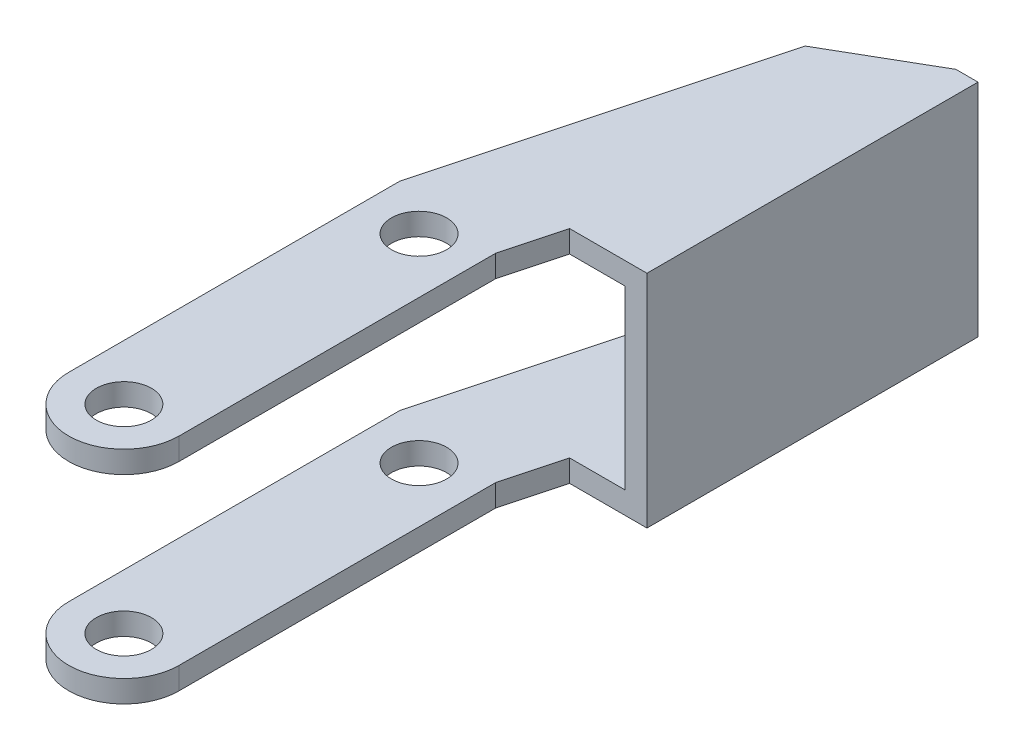
ISO-10303-21;
HEADER;
FILE_DESCRIPTION(('STEP AP214'),'2;1');
FILE_NAME('part.step','',(''),(''),'','','');
FILE_SCHEMA(('AUTOMOTIVE_DESIGN { 1 0 10303 214 1 1 1 1 }'));
ENDSEC;
DATA;
#1=APPLICATION_CONTEXT('core data for automotive mechanical design processes');
#2=APPLICATION_PROTOCOL_DEFINITION('international standard','automotive_design',2000,#1);
#3=PRODUCT_CONTEXT('',#1,'mechanical');
#4=PRODUCT('Part','Part','',(#3));
#5=PRODUCT_RELATED_PRODUCT_CATEGORY('part','',(#4));
#6=PRODUCT_DEFINITION_FORMATION('','',#4);
#7=PRODUCT_DEFINITION_CONTEXT('part definition',#1,'design');
#8=PRODUCT_DEFINITION('design','',#6,#7);
#9=PRODUCT_DEFINITION_SHAPE('','',#8);
#10=(LENGTH_UNIT() NAMED_UNIT(*) SI_UNIT(.MILLI.,.METRE.));
#11=(NAMED_UNIT(*) PLANE_ANGLE_UNIT() SI_UNIT($,.RADIAN.));
#12=(NAMED_UNIT(*) SI_UNIT($,.STERADIAN.) SOLID_ANGLE_UNIT());
#13=UNCERTAINTY_MEASURE_WITH_UNIT(LENGTH_MEASURE(1.E-05),#10,'distance_accuracy_value','');
#14=(GEOMETRIC_REPRESENTATION_CONTEXT(3) GLOBAL_UNCERTAINTY_ASSIGNED_CONTEXT((#13)) GLOBAL_UNIT_ASSIGNED_CONTEXT((#10,
#11,#12)) REPRESENTATION_CONTEXT('',''));
#15=CARTESIAN_POINT('',(0.,0.,0.));
#16=DIRECTION('',(0.,0.,1.));
#17=DIRECTION('',(1.,0.,0.));
#18=AXIS2_PLACEMENT_3D('',#15,#16,#17);
#19=CARTESIAN_POINT('',(-22.,0.,-1.52743803433517E-13));
#20=DIRECTION('',(-1.,0.,0.));
#21=DIRECTION('',(0.,0.,1.));
#22=AXIS2_PLACEMENT_3D('',#19,#20,#21);
#23=PLANE('',#22);
#24=DIRECTION('',(0.,-1.,0.));
#25=VECTOR('',#24,1.);
#26=CARTESIAN_POINT('',(-21.9999999999999,10.,-15.0000000000001));
#27=LINE('',#26,#25);
#28=CARTESIAN_POINT('',(-21.9999999999999,8.,-15.0000000000001));
#29=VERTEX_POINT('',#28);
#30=CARTESIAN_POINT('',(-21.9999999999999,-8.,-15.0000000000001));
#31=VERTEX_POINT('',#30);
#32=EDGE_CURVE('E299',#29,#31,#27,.T.);
#33=ORIENTED_EDGE('',*,*,#32,.T.);
#34=DIRECTION('',(0.,0.,1.));
#35=VECTOR('',#34,1.);
#36=CARTESIAN_POINT('',(-22.,-8.,-1.52655665885959E-13));
#37=LINE('',#36,#35);
#38=CARTESIAN_POINT('',(-22.0000000000001,-8.,14.9999999999999));
#39=VERTEX_POINT('',#38);
#40=EDGE_CURVE('E51',#31,#39,#37,.T.);
#41=ORIENTED_EDGE('',*,*,#40,.T.);
#42=DIRECTION('',(0.,1.,0.));
#43=VECTOR('',#42,1.);
#44=CARTESIAN_POINT('',(-22.0000000000001,10.,14.9999999999999));
#45=LINE('',#44,#43);
#46=CARTESIAN_POINT('',(-22.0000000000001,8.,14.9999999999999));
#47=VERTEX_POINT('',#46);
#48=EDGE_CURVE('E297',#39,#47,#45,.T.);
#49=ORIENTED_EDGE('',*,*,#48,.T.);
#50=DIRECTION('',(0.,0.,1.));
#51=VECTOR('',#50,1.);
#52=CARTESIAN_POINT('',(-22.,8.,-1.52655665885959E-13));
#53=LINE('',#52,#51);
#54=EDGE_CURVE('E252',#29,#47,#53,.T.);
#55=ORIENTED_EDGE('',*,*,#54,.F.);
#56=EDGE_LOOP('',(#33,#41,#49,#55));
#57=FACE_BOUND('',#56,.T.);
#58=ADVANCED_FACE('F36',(#57),#23,.T.);
#59=CARTESIAN_POINT('',(-22.0000000000001,10.,14.9999999999999));
#60=DIRECTION('',(0.,0.,-1.));
#61=DIRECTION('',(-1.,0.,0.));
#62=AXIS2_PLACEMENT_3D('',#59,#60,#61);
#63=PLANE('',#62);
#64=DIRECTION('',(0.,1.,0.));
#65=VECTOR('',#64,1.);
#66=CARTESIAN_POINT('',(-20.0000000000001,10.,14.9999999999999));
#67=LINE('',#66,#65);
#68=CARTESIAN_POINT('',(-20.0000000000001,-10.,14.9999999999999));
#69=VERTEX_POINT('',#68);
#70=CARTESIAN_POINT('',(-20.0000000000001,10.,14.9999999999999));
#71=VERTEX_POINT('',#70);
#72=EDGE_CURVE('E286',#69,#71,#67,.T.);
#73=ORIENTED_EDGE('',*,*,#72,.T.);
#74=DIRECTION('',(1.,0.,0.));
#75=VECTOR('',#74,1.);
#76=CARTESIAN_POINT('',(-22.0000000000001,10.,14.9999999999999));
#77=LINE('',#76,#75);
#78=CARTESIAN_POINT('',(-27.0062220445211,10.,14.9999999999999));
#79=VERTEX_POINT('',#78);
#80=EDGE_CURVE('E11',#79,#71,#77,.T.);
#81=ORIENTED_EDGE('',*,*,#80,.F.);
#82=DIRECTION('',(0.,1.,0.));
#83=VECTOR('',#82,1.);
#84=CARTESIAN_POINT('',(-27.0062220445211,8.,14.9999999999999));
#85=LINE('',#84,#83);
#86=CARTESIAN_POINT('',(-27.0062220445211,8.,14.9999999999999));
#87=VERTEX_POINT('',#86);
#88=EDGE_CURVE('E289',#87,#79,#85,.T.);
#89=ORIENTED_EDGE('',*,*,#88,.F.);
#90=DIRECTION('',(1.,0.,0.));
#91=VECTOR('',#90,1.);
#92=CARTESIAN_POINT('',(0.,8.,15.));
#93=LINE('',#92,#91);
#94=EDGE_CURVE('E249',#87,#47,#93,.T.);
#95=ORIENTED_EDGE('',*,*,#94,.T.);
#96=ORIENTED_EDGE('',*,*,#48,.F.);
#97=DIRECTION('',(1.,0.,0.));
#98=VECTOR('',#97,1.);
#99=CARTESIAN_POINT('',(0.,-8.,15.));
#100=LINE('',#99,#98);
#101=CARTESIAN_POINT('',(-27.0062220445211,-8.,14.9999999999999));
#102=VERTEX_POINT('',#101);
#103=EDGE_CURVE('E191',#102,#39,#100,.T.);
#104=ORIENTED_EDGE('',*,*,#103,.F.);
#105=DIRECTION('',(0.,-1.,0.));
#106=VECTOR('',#105,1.);
#107=CARTESIAN_POINT('',(-27.0062220445211,-8.,14.9999999999999));
#108=LINE('',#107,#106);
#109=CARTESIAN_POINT('',(-27.0062220445211,-10.,14.9999999999999));
#110=VERTEX_POINT('',#109);
#111=EDGE_CURVE('E226',#102,#110,#108,.T.);
#112=ORIENTED_EDGE('',*,*,#111,.T.);
#113=DIRECTION('',(1.,0.,0.));
#114=VECTOR('',#113,1.);
#115=CARTESIAN_POINT('',(-22.0000000000001,-10.,14.9999999999999));
#116=LINE('',#115,#114);
#117=EDGE_CURVE('E304',#110,#69,#116,.T.);
#118=ORIENTED_EDGE('',*,*,#117,.T.);
#119=EDGE_LOOP('',(#73,#81,#89,#95,#96,#104,#112,#118));
#120=FACE_BOUND('',#119,.T.);
#121=ADVANCED_FACE('F38',(#120),#63,.F.);
#122=CARTESIAN_POINT('',(-21.9999999999999,10.,-15.0000000000001));
#123=DIRECTION('',(0.,-1.,0.));
#124=DIRECTION('',(0.,0.,-1.));
#125=AXIS2_PLACEMENT_3D('',#122,#123,#124);
#126=PLANE('',#125);
#127=DIRECTION('',(0.,0.,-1.));
#128=VECTOR('',#127,1.);
#129=CARTESIAN_POINT('',(-19.9999999999999,10.,-15.0000000000001));
#130=LINE('',#129,#128);
#131=CARTESIAN_POINT('',(-19.9999999999999,10.,-15.0000000000001));
#132=VERTEX_POINT('',#131);
#133=EDGE_CURVE('E307',#71,#132,#130,.T.);
#134=ORIENTED_EDGE('',*,*,#133,.T.);
#135=DIRECTION('',(1.,0.,0.));
#136=VECTOR('',#135,1.);
#137=CARTESIAN_POINT('',(-21.9999999999999,10.,-15.0000000000001));
#138=LINE('',#137,#136);
#139=CARTESIAN_POINT('',(-21.9999999999999,10.,-15.0000000000001));
#140=VERTEX_POINT('',#139);
#141=EDGE_CURVE('E44',#140,#132,#138,.T.);
#142=ORIENTED_EDGE('',*,*,#141,.F.);
#143=DIRECTION('',(-0.866025403784429,0.,0.500000000000017));
#144=VECTOR('',#143,1.);
#145=CARTESIAN_POINT('',(-11.9951905283838,10.,-20.7762794416288));
#146=LINE('',#145,#144);
#147=CARTESIAN_POINT('',(-30.6602540378442,10.,-9.99999999999994));
#148=VERTEX_POINT('',#147);
#149=EDGE_CURVE('E279',#140,#148,#146,.T.);
#150=ORIENTED_EDGE('',*,*,#149,.T.);
#151=DIRECTION('',(-0.2588190451025,0.,0.965925826289074));
#152=VECTOR('',#151,1.);
#153=CARTESIAN_POINT('',(-31.106406460551,10.,-8.33493649053818));
#154=LINE('',#153,#152);
#155=CARTESIAN_POINT('',(-38.4248253909192,10.,18.9777747886723));
#156=VERTEX_POINT('',#155);
#157=EDGE_CURVE('E235',#148,#156,#154,.T.);
#158=ORIENTED_EDGE('',*,*,#157,.T.);
#159=DIRECTION('',(0.,0.,1.));
#160=VECTOR('',#159,1.);
#161=CARTESIAN_POINT('',(-38.4248253909192,10.,0.));
#162=LINE('',#161,#160);
#163=CARTESIAN_POINT('',(-38.4248253909192,10.,48.9777747886723));
#164=VERTEX_POINT('',#163);
#165=EDGE_CURVE('E267',#156,#164,#162,.T.);
#166=ORIENTED_EDGE('',*,*,#165,.T.);
#167=CARTESIAN_POINT('',(-33.4248253909194,10.,48.9777747886723));
#168=DIRECTION('',(0.,1.,0.));
#169=DIRECTION('',(0.,0.,1.));
#170=AXIS2_PLACEMENT_3D('',#167,#168,#169);
#171=CIRCLE('',#170,5.);
#172=CARTESIAN_POINT('',(-28.4248253909192,10.,48.9777747886723));
#173=VERTEX_POINT('',#172);
#174=EDGE_CURVE('E270',#164,#173,#171,.T.);
#175=ORIENTED_EDGE('',*,*,#174,.T.);
#176=DIRECTION('',(0.,0.,1.));
#177=VECTOR('',#176,1.);
#178=CARTESIAN_POINT('',(-28.4248253909192,10.,0.));
#179=LINE('',#178,#177);
#180=CARTESIAN_POINT('',(-28.4248253909192,10.,20.2942997645461));
#181=VERTEX_POINT('',#180);
#182=EDGE_CURVE('E273',#181,#173,#179,.T.);
#183=ORIENTED_EDGE('',*,*,#182,.F.);
#184=DIRECTION('',(0.258819045102463,0.,-0.965925826289084));
#185=VECTOR('',#184,1.);
#186=CARTESIAN_POINT('',(-21.4471481976615,10.,-5.74674603951261));
#187=LINE('',#186,#185);
#188=EDGE_CURVE('E276',#181,#79,#187,.T.);
#189=ORIENTED_EDGE('',*,*,#188,.T.);
#190=ORIENTED_EDGE('',*,*,#80,.T.);
#191=EDGE_LOOP('',(#134,#142,#150,#158,#166,#175,#183,#189,#190));
#192=FACE_BOUND('',#191,.T.);
#193=CARTESIAN_POINT('',(-33.4248253909194,10.,22.2299626663351));
#194=DIRECTION('',(0.,1.,0.));
#195=DIRECTION('',(0.,0.,1.));
#196=AXIS2_PLACEMENT_3D('',#193,#194,#195);
#197=CIRCLE('',#196,2.5);
#198=CARTESIAN_POINT('',(-33.4248253909194,10.,24.7299626663351));
#199=VERTEX_POINT('',#198);
#200=EDGE_CURVE('E221',#199,#199,#197,.T.);
#201=ORIENTED_EDGE('',*,*,#200,.F.);
#202=EDGE_LOOP('',(#201));
#203=FACE_BOUND('',#202,.T.);
#204=CARTESIAN_POINT('',(-33.4248253909192,10.,48.9777747886723));
#205=DIRECTION('',(0.,1.,0.));
#206=DIRECTION('',(0.,0.,1.));
#207=AXIS2_PLACEMENT_3D('',#204,#205,#206);
#208=CIRCLE('',#207,2.5);
#209=CARTESIAN_POINT('',(-33.4248253909192,10.,51.4777747886723));
#210=VERTEX_POINT('',#209);
#211=EDGE_CURVE('E264',#210,#210,#208,.T.);
#212=ORIENTED_EDGE('',*,*,#211,.F.);
#213=EDGE_LOOP('',(#212));
#214=FACE_BOUND('',#213,.T.);
#215=ADVANCED_FACE('F363',(#192,#203,#214),#126,.F.);
#216=CARTESIAN_POINT('',(-21.9999999999999,10.,-15.0000000000001));
#217=DIRECTION('',(0.,0.,1.));
#218=DIRECTION('',(1.,0.,0.));
#219=AXIS2_PLACEMENT_3D('',#216,#217,#218);
#220=PLANE('',#219);
#221=DIRECTION('',(0.,-1.,0.));
#222=VECTOR('',#221,1.);
#223=CARTESIAN_POINT('',(-19.9999999999999,10.,-15.0000000000001));
#224=LINE('',#223,#222);
#225=CARTESIAN_POINT('',(-19.9999999999999,-10.,-15.0000000000001));
#226=VERTEX_POINT('',#225);
#227=EDGE_CURVE('E309',#132,#226,#224,.T.);
#228=ORIENTED_EDGE('',*,*,#227,.T.);
#229=DIRECTION('',(1.,0.,0.));
#230=VECTOR('',#229,1.);
#231=CARTESIAN_POINT('',(-21.9999999999999,-10.,-15.0000000000001));
#232=LINE('',#231,#230);
#233=CARTESIAN_POINT('',(-21.9999999999999,-10.,-15.0000000000001));
#234=VERTEX_POINT('',#233);
#235=EDGE_CURVE('E314',#234,#226,#232,.T.);
#236=ORIENTED_EDGE('',*,*,#235,.F.);
#237=DIRECTION('',(0.,-1.,0.));
#238=VECTOR('',#237,1.);
#239=CARTESIAN_POINT('',(-21.9999999999999,-8.,-15.0000000000001));
#240=LINE('',#239,#238);
#241=EDGE_CURVE('E59',#31,#234,#240,.T.);
#242=ORIENTED_EDGE('',*,*,#241,.F.);
#243=ORIENTED_EDGE('',*,*,#32,.F.);
#244=EDGE_CURVE('E301',#140,#29,#27,.T.);
#245=ORIENTED_EDGE('',*,*,#244,.F.);
#246=ORIENTED_EDGE('',*,*,#141,.T.);
#247=EDGE_LOOP('',(#228,#236,#242,#243,#245,#246));
#248=FACE_BOUND('',#247,.T.);
#249=ADVANCED_FACE('F319',(#248),#220,.F.);
#250=CARTESIAN_POINT('',(-21.9999999999999,-10.,-15.0000000000001));
#251=DIRECTION('',(0.,1.,0.));
#252=DIRECTION('',(0.,0.,1.));
#253=AXIS2_PLACEMENT_3D('',#250,#251,#252);
#254=PLANE('',#253);
#255=DIRECTION('',(0.,0.,1.));
#256=VECTOR('',#255,1.);
#257=CARTESIAN_POINT('',(-19.9999999999999,-10.,-15.0000000000001));
#258=LINE('',#257,#256);
#259=EDGE_CURVE('E300',#226,#69,#258,.T.);
#260=ORIENTED_EDGE('',*,*,#259,.T.);
#261=ORIENTED_EDGE('',*,*,#117,.F.);
#262=DIRECTION('',(0.258819045102463,0.,-0.965925826289084));
#263=VECTOR('',#262,1.);
#264=CARTESIAN_POINT('',(-21.4471481976615,-10.,-5.74674603951261));
#265=LINE('',#264,#263);
#266=CARTESIAN_POINT('',(-28.4248253909192,-10.,20.2942997645461));
#267=VERTEX_POINT('',#266);
#268=EDGE_CURVE('E211',#267,#110,#265,.T.);
#269=ORIENTED_EDGE('',*,*,#268,.F.);
#270=DIRECTION('',(0.,0.,1.));
#271=VECTOR('',#270,1.);
#272=CARTESIAN_POINT('',(-28.4248253909192,-10.,0.));
#273=LINE('',#272,#271);
#274=CARTESIAN_POINT('',(-28.4248253909192,-10.,48.9777747886723));
#275=VERTEX_POINT('',#274);
#276=EDGE_CURVE('E214',#267,#275,#273,.T.);
#277=ORIENTED_EDGE('',*,*,#276,.T.);
#278=CARTESIAN_POINT('',(-33.4248253909194,-10.,48.9777747886723));
#279=DIRECTION('',(0.,1.,0.));
#280=DIRECTION('',(0.,0.,1.));
#281=AXIS2_PLACEMENT_3D('',#278,#279,#280);
#282=CIRCLE('',#281,5.);
#283=CARTESIAN_POINT('',(-38.4248253909192,-10.,48.9777747886723));
#284=VERTEX_POINT('',#283);
#285=EDGE_CURVE('E217',#284,#275,#282,.T.);
#286=ORIENTED_EDGE('',*,*,#285,.F.);
#287=DIRECTION('',(0.,0.,1.));
#288=VECTOR('',#287,1.);
#289=CARTESIAN_POINT('',(-38.4248253909192,-10.,0.));
#290=LINE('',#289,#288);
#291=CARTESIAN_POINT('',(-38.4248253909192,-10.,18.9777747886723));
#292=VERTEX_POINT('',#291);
#293=EDGE_CURVE('E206',#292,#284,#290,.T.);
#294=ORIENTED_EDGE('',*,*,#293,.F.);
#295=DIRECTION('',(-0.2588190451025,0.,0.965925826289074));
#296=VECTOR('',#295,1.);
#297=CARTESIAN_POINT('',(-31.106406460551,-10.,-8.33493649053818));
#298=LINE('',#297,#296);
#299=CARTESIAN_POINT('',(-30.6602540378442,-10.,-9.99999999999994));
#300=VERTEX_POINT('',#299);
#301=EDGE_CURVE('E172',#300,#292,#298,.T.);
#302=ORIENTED_EDGE('',*,*,#301,.F.);
#303=DIRECTION('',(-0.866025403784429,0.,0.500000000000017));
#304=VECTOR('',#303,1.);
#305=CARTESIAN_POINT('',(-11.9951905283838,-10.,-20.7762794416288));
#306=LINE('',#305,#304);
#307=EDGE_CURVE('E209',#234,#300,#306,.T.);
#308=ORIENTED_EDGE('',*,*,#307,.F.);
#309=ORIENTED_EDGE('',*,*,#235,.T.);
#310=EDGE_LOOP('',(#260,#261,#269,#277,#286,#294,#302,#308,#309));
#311=FACE_BOUND('',#310,.T.);
#312=CARTESIAN_POINT('',(-33.4248253909194,-10.,22.2299626663351));
#313=DIRECTION('',(0.,1.,0.));
#314=DIRECTION('',(0.,0.,1.));
#315=AXIS2_PLACEMENT_3D('',#312,#313,#314);
#316=CIRCLE('',#315,2.5);
#317=CARTESIAN_POINT('',(-33.4248253909194,-10.,24.7299626663351));
#318=VERTEX_POINT('',#317);
#319=EDGE_CURVE('E200',#318,#318,#316,.T.);
#320=ORIENTED_EDGE('',*,*,#319,.T.);
#321=EDGE_LOOP('',(#320));
#322=FACE_BOUND('',#321,.T.);
#323=CARTESIAN_POINT('',(-33.4248253909192,-10.,48.9777747886723));
#324=DIRECTION('',(0.,1.,0.));
#325=DIRECTION('',(0.,0.,1.));
#326=AXIS2_PLACEMENT_3D('',#323,#324,#325);
#327=CIRCLE('',#326,2.5);
#328=CARTESIAN_POINT('',(-33.4248253909192,-10.,51.4777747886723));
#329=VERTEX_POINT('',#328);
#330=EDGE_CURVE('E203',#329,#329,#327,.T.);
#331=ORIENTED_EDGE('',*,*,#330,.T.);
#332=EDGE_LOOP('',(#331));
#333=FACE_BOUND('',#332,.T.);
#334=ADVANCED_FACE('F327',(#311,#322,#333),#254,.F.);
#335=CARTESIAN_POINT('',(-20.,0.,-1.38777878078145E-13));
#336=DIRECTION('',(-1.,0.,0.));
#337=DIRECTION('',(0.,0.,1.));
#338=AXIS2_PLACEMENT_3D('',#335,#336,#337);
#339=PLANE('',#338);
#340=ORIENTED_EDGE('',*,*,#72,.F.);
#341=ORIENTED_EDGE('',*,*,#259,.F.);
#342=ORIENTED_EDGE('',*,*,#227,.F.);
#343=ORIENTED_EDGE('',*,*,#133,.F.);
#344=EDGE_LOOP('',(#340,#341,#342,#343));
#345=FACE_BOUND('',#344,.T.);
#346=ADVANCED_FACE('F325',(#345),#339,.F.);
#347=CARTESIAN_POINT('',(-38.4248253909192,8.,0.));
#348=DIRECTION('',(-1.,0.,0.));
#349=DIRECTION('',(0.,0.,1.));
#350=AXIS2_PLACEMENT_3D('',#347,#348,#349);
#351=PLANE('',#350);
#352=ORIENTED_EDGE('',*,*,#165,.F.);
#353=DIRECTION('',(0.,1.,0.));
#354=VECTOR('',#353,1.);
#355=CARTESIAN_POINT('',(-38.4248253909192,8.,18.9777747886723));
#356=LINE('',#355,#354);
#357=CARTESIAN_POINT('',(-38.4248253909192,8.,18.9777747886723));
#358=VERTEX_POINT('',#357);
#359=EDGE_CURVE('E284',#358,#156,#356,.T.);
#360=ORIENTED_EDGE('',*,*,#359,.F.);
#361=DIRECTION('',(0.,0.,1.));
#362=VECTOR('',#361,1.);
#363=CARTESIAN_POINT('',(-38.4248253909192,8.,0.));
#364=LINE('',#363,#362);
#365=CARTESIAN_POINT('',(-38.4248253909192,8.,48.9777747886723));
#366=VERTEX_POINT('',#365);
#367=EDGE_CURVE('E238',#358,#366,#364,.T.);
#368=ORIENTED_EDGE('',*,*,#367,.T.);
#369=DIRECTION('',(0.,1.,0.));
#370=VECTOR('',#369,1.);
#371=CARTESIAN_POINT('',(-38.4248253909192,8.,48.9777747886723));
#372=LINE('',#371,#370);
#373=EDGE_CURVE('E261',#366,#164,#372,.T.);
#374=ORIENTED_EDGE('',*,*,#373,.T.);
#375=EDGE_LOOP('',(#352,#360,#368,#374));
#376=FACE_BOUND('',#375,.T.);
#377=ADVANCED_FACE('F370',(#376),#351,.T.);
#378=CARTESIAN_POINT('',(-31.106406460551,8.,-8.33493649053818));
#379=DIRECTION('',(-0.965925826289074,0.,-0.2588190451025));
#380=DIRECTION('',(-0.2588190451025,0.,0.965925826289074));
#381=AXIS2_PLACEMENT_3D('',#378,#379,#380);
#382=PLANE('',#381);
#383=ORIENTED_EDGE('',*,*,#157,.F.);
#384=DIRECTION('',(0.,1.,0.));
#385=VECTOR('',#384,1.);
#386=CARTESIAN_POINT('',(-30.6602540378442,8.,-9.99999999999994));
#387=LINE('',#386,#385);
#388=CARTESIAN_POINT('',(-30.6602540378442,8.,-9.99999999999994));
#389=VERTEX_POINT('',#388);
#390=EDGE_CURVE('E287',#389,#148,#387,.T.);
#391=ORIENTED_EDGE('',*,*,#390,.F.);
#392=DIRECTION('',(-0.2588190451025,0.,0.965925826289074));
#393=VECTOR('',#392,1.);
#394=CARTESIAN_POINT('',(-31.106406460551,8.,-8.33493649053818));
#395=LINE('',#394,#393);
#396=EDGE_CURVE('E258',#389,#358,#395,.T.);
#397=ORIENTED_EDGE('',*,*,#396,.T.);
#398=ORIENTED_EDGE('',*,*,#359,.T.);
#399=EDGE_LOOP('',(#383,#391,#397,#398));
#400=FACE_BOUND('',#399,.T.);
#401=ADVANCED_FACE('F399',(#400),#382,.T.);
#402=CARTESIAN_POINT('',(-11.9951905283838,8.,-20.7762794416288));
#403=DIRECTION('',(-0.500000000000017,0.,-0.866025403784429));
#404=DIRECTION('',(-0.866025403784429,0.,0.500000000000017));
#405=AXIS2_PLACEMENT_3D('',#402,#403,#404);
#406=PLANE('',#405);
#407=ORIENTED_EDGE('',*,*,#149,.F.);
#408=ORIENTED_EDGE('',*,*,#244,.T.);
#409=DIRECTION('',(-0.866025403784429,0.,0.500000000000017));
#410=VECTOR('',#409,1.);
#411=CARTESIAN_POINT('',(-11.9951905283838,8.,-20.7762794416288));
#412=LINE('',#411,#410);
#413=EDGE_CURVE('E255',#29,#389,#412,.T.);
#414=ORIENTED_EDGE('',*,*,#413,.T.);
#415=ORIENTED_EDGE('',*,*,#390,.T.);
#416=EDGE_LOOP('',(#407,#408,#414,#415));
#417=FACE_BOUND('',#416,.T.);
#418=ADVANCED_FACE('F407',(#417),#406,.T.);
#419=CARTESIAN_POINT('',(-21.4471481976615,8.,-5.74674603951261));
#420=DIRECTION('',(0.965925826289084,0.,0.258819045102463));
#421=DIRECTION('',(0.258819045102463,0.,-0.965925826289084));
#422=AXIS2_PLACEMENT_3D('',#419,#420,#421);
#423=PLANE('',#422);
#424=ORIENTED_EDGE('',*,*,#188,.F.);
#425=DIRECTION('',(0.,1.,0.));
#426=VECTOR('',#425,1.);
#427=CARTESIAN_POINT('',(-28.4248253909192,8.,20.2942997645461));
#428=LINE('',#427,#426);
#429=CARTESIAN_POINT('',(-28.4248253909192,8.,20.2942997645461));
#430=VERTEX_POINT('',#429);
#431=EDGE_CURVE('E292',#430,#181,#428,.T.);
#432=ORIENTED_EDGE('',*,*,#431,.F.);
#433=DIRECTION('',(0.258819045102463,0.,-0.965925826289084));
#434=VECTOR('',#433,1.);
#435=CARTESIAN_POINT('',(-21.4471481976615,8.,-5.74674603951261));
#436=LINE('',#435,#434);
#437=EDGE_CURVE('E246',#430,#87,#436,.T.);
#438=ORIENTED_EDGE('',*,*,#437,.T.);
#439=ORIENTED_EDGE('',*,*,#88,.T.);
#440=EDGE_LOOP('',(#424,#432,#438,#439));
#441=FACE_BOUND('',#440,.T.);
#442=ADVANCED_FACE('F392',(#441),#423,.T.);
#443=CARTESIAN_POINT('',(-28.4248253909192,8.,0.));
#444=DIRECTION('',(-1.,0.,0.));
#445=DIRECTION('',(0.,0.,1.));
#446=AXIS2_PLACEMENT_3D('',#443,#444,#445);
#447=PLANE('',#446);
#448=ORIENTED_EDGE('',*,*,#182,.T.);
#449=DIRECTION('',(0.,1.,0.));
#450=VECTOR('',#449,1.);
#451=CARTESIAN_POINT('',(-28.4248253909192,8.,48.9777747886723));
#452=LINE('',#451,#450);
#453=CARTESIAN_POINT('',(-28.4248253909192,8.,48.9777747886723));
#454=VERTEX_POINT('',#453);
#455=EDGE_CURVE('E294',#454,#173,#452,.T.);
#456=ORIENTED_EDGE('',*,*,#455,.F.);
#457=DIRECTION('',(0.,0.,1.));
#458=VECTOR('',#457,1.);
#459=CARTESIAN_POINT('',(-28.4248253909192,8.,0.));
#460=LINE('',#459,#458);
#461=EDGE_CURVE('E244',#430,#454,#460,.T.);
#462=ORIENTED_EDGE('',*,*,#461,.F.);
#463=ORIENTED_EDGE('',*,*,#431,.T.);
#464=EDGE_LOOP('',(#448,#456,#462,#463));
#465=FACE_BOUND('',#464,.T.);
#466=ADVANCED_FACE('F384',(#465),#447,.F.);
#467=CARTESIAN_POINT('',(-33.4248253909192,8.,48.9777747886723));
#468=DIRECTION('',(0.,1.,0.));
#469=DIRECTION('',(0.,0.,1.));
#470=AXIS2_PLACEMENT_3D('',#467,#468,#469);
#471=CYLINDRICAL_SURFACE('',#470,2.5);
#472=CARTESIAN_POINT('',(-33.4248253909192,8.,48.9777747886723));
#473=DIRECTION('',(0.,1.,0.));
#474=DIRECTION('',(0.,0.,1.));
#475=AXIS2_PLACEMENT_3D('',#472,#473,#474);
#476=CIRCLE('',#475,2.5);
#477=CARTESIAN_POINT('',(-33.4248253909192,8.,51.4777747886723));
#478=VERTEX_POINT('',#477);
#479=EDGE_CURVE('E234',#478,#478,#476,.T.);
#480=ORIENTED_EDGE('',*,*,#479,.F.);
#481=EDGE_LOOP('',(#480));
#482=FACE_BOUND('',#481,.T.);
#483=ORIENTED_EDGE('',*,*,#211,.T.);
#484=EDGE_LOOP('',(#483));
#485=FACE_BOUND('',#484,.T.);
#486=ADVANCED_FACE('F382',(#482,#485),#471,.F.);
#487=CARTESIAN_POINT('',(-33.4248253909194,8.,22.2299626663351));
#488=DIRECTION('',(0.,1.,0.));
#489=DIRECTION('',(0.,0.,1.));
#490=AXIS2_PLACEMENT_3D('',#487,#488,#489);
#491=CYLINDRICAL_SURFACE('',#490,2.5);
#492=CARTESIAN_POINT('',(-33.4248253909194,8.,22.2299626663351));
#493=DIRECTION('',(0.,1.,0.));
#494=DIRECTION('',(0.,0.,1.));
#495=AXIS2_PLACEMENT_3D('',#492,#493,#494);
#496=CIRCLE('',#495,2.5);
#497=CARTESIAN_POINT('',(-33.4248253909194,8.,24.7299626663351));
#498=VERTEX_POINT('',#497);
#499=EDGE_CURVE('E231',#498,#498,#496,.T.);
#500=ORIENTED_EDGE('',*,*,#499,.F.);
#501=EDGE_LOOP('',(#500));
#502=FACE_BOUND('',#501,.T.);
#503=ORIENTED_EDGE('',*,*,#200,.T.);
#504=EDGE_LOOP('',(#503));
#505=FACE_BOUND('',#504,.T.);
#506=ADVANCED_FACE('F366',(#502,#505),#491,.F.);
#507=CARTESIAN_POINT('',(-33.4248253909194,8.,48.9777747886723));
#508=DIRECTION('',(0.,1.,0.));
#509=DIRECTION('',(0.,0.,1.));
#510=AXIS2_PLACEMENT_3D('',#507,#508,#509);
#511=CYLINDRICAL_SURFACE('',#510,5.);
#512=ORIENTED_EDGE('',*,*,#174,.F.);
#513=ORIENTED_EDGE('',*,*,#373,.F.);
#514=CARTESIAN_POINT('',(-33.4248253909194,8.,48.9777747886723));
#515=DIRECTION('',(0.,1.,0.));
#516=DIRECTION('',(0.,0.,1.));
#517=AXIS2_PLACEMENT_3D('',#514,#515,#516);
#518=CIRCLE('',#517,5.);
#519=EDGE_CURVE('E241',#366,#454,#518,.T.);
#520=ORIENTED_EDGE('',*,*,#519,.T.);
#521=ORIENTED_EDGE('',*,*,#455,.T.);
#522=EDGE_LOOP('',(#512,#513,#520,#521));
#523=FACE_BOUND('',#522,.T.);
#524=ADVANCED_FACE('F390',(#523),#511,.T.);
#525=CARTESIAN_POINT('',(0.,8.,0.));
#526=DIRECTION('',(0.,1.,0.));
#527=DIRECTION('',(0.,0.,1.));
#528=AXIS2_PLACEMENT_3D('',#525,#526,#527);
#529=PLANE('',#528);
#530=ORIENTED_EDGE('',*,*,#499,.T.);
#531=EDGE_LOOP('',(#530));
#532=FACE_BOUND('',#531,.T.);
#533=ORIENTED_EDGE('',*,*,#479,.T.);
#534=EDGE_LOOP('',(#533));
#535=FACE_BOUND('',#534,.T.);
#536=ORIENTED_EDGE('',*,*,#367,.F.);
#537=ORIENTED_EDGE('',*,*,#396,.F.);
#538=ORIENTED_EDGE('',*,*,#413,.F.);
#539=ORIENTED_EDGE('',*,*,#54,.T.);
#540=ORIENTED_EDGE('',*,*,#94,.F.);
#541=ORIENTED_EDGE('',*,*,#437,.F.);
#542=ORIENTED_EDGE('',*,*,#461,.T.);
#543=ORIENTED_EDGE('',*,*,#519,.F.);
#544=EDGE_LOOP('',(#536,#537,#538,#539,#540,#541,#542,#543));
#545=FACE_BOUND('',#544,.T.);
#546=ADVANCED_FACE('F402',(#532,#535,#545),#529,.F.);
#547=CARTESIAN_POINT('',(-38.4248253909192,-8.,0.));
#548=DIRECTION('',(1.,0.,0.));
#549=DIRECTION('',(0.,0.,-1.));
#550=AXIS2_PLACEMENT_3D('',#547,#548,#549);
#551=PLANE('',#550);
#552=ORIENTED_EDGE('',*,*,#293,.T.);
#553=DIRECTION('',(0.,-1.,0.));
#554=VECTOR('',#553,1.);
#555=CARTESIAN_POINT('',(-38.4248253909192,-8.,48.9777747886723));
#556=LINE('',#555,#554);
#557=CARTESIAN_POINT('',(-38.4248253909192,-8.,48.9777747886723));
#558=VERTEX_POINT('',#557);
#559=EDGE_CURVE('E181',#558,#284,#556,.T.);
#560=ORIENTED_EDGE('',*,*,#559,.F.);
#561=DIRECTION('',(0.,0.,1.));
#562=VECTOR('',#561,1.);
#563=CARTESIAN_POINT('',(-38.4248253909192,-8.,0.));
#564=LINE('',#563,#562);
#565=CARTESIAN_POINT('',(-38.4248253909192,-8.,18.9777747886723));
#566=VERTEX_POINT('',#565);
#567=EDGE_CURVE('E160',#566,#558,#564,.T.);
#568=ORIENTED_EDGE('',*,*,#567,.F.);
#569=DIRECTION('',(0.,-1.,0.));
#570=VECTOR('',#569,1.);
#571=CARTESIAN_POINT('',(-38.4248253909192,-8.,18.9777747886723));
#572=LINE('',#571,#570);
#573=EDGE_CURVE('E169',#566,#292,#572,.T.);
#574=ORIENTED_EDGE('',*,*,#573,.T.);
#575=EDGE_LOOP('',(#552,#560,#568,#574));
#576=FACE_BOUND('',#575,.T.);
#577=ADVANCED_FACE('F179',(#576),#551,.F.);
#578=CARTESIAN_POINT('',(-33.4248253909194,-8.,48.9777747886723));
#579=DIRECTION('',(0.,-1.,0.));
#580=DIRECTION('',(0.,0.,-1.));
#581=AXIS2_PLACEMENT_3D('',#578,#579,#580);
#582=CYLINDRICAL_SURFACE('',#581,5.);
#583=ORIENTED_EDGE('',*,*,#285,.T.);
#584=DIRECTION('',(0.,-1.,0.));
#585=VECTOR('',#584,1.);
#586=CARTESIAN_POINT('',(-28.4248253909192,-8.,48.9777747886723));
#587=LINE('',#586,#585);
#588=CARTESIAN_POINT('',(-28.4248253909192,-8.,48.9777747886723));
#589=VERTEX_POINT('',#588);
#590=EDGE_CURVE('E222',#589,#275,#587,.T.);
#591=ORIENTED_EDGE('',*,*,#590,.F.);
#592=CARTESIAN_POINT('',(-33.4248253909194,-8.,48.9777747886723));
#593=DIRECTION('',(0.,1.,0.));
#594=DIRECTION('',(0.,0.,1.));
#595=AXIS2_PLACEMENT_3D('',#592,#593,#594);
#596=CIRCLE('',#595,5.);
#597=EDGE_CURVE('E177',#558,#589,#596,.T.);
#598=ORIENTED_EDGE('',*,*,#597,.F.);
#599=ORIENTED_EDGE('',*,*,#559,.T.);
#600=EDGE_LOOP('',(#583,#591,#598,#599));
#601=FACE_BOUND('',#600,.T.);
#602=ADVANCED_FACE('F343',(#601),#582,.T.);
#603=CARTESIAN_POINT('',(-28.4248253909192,-8.,0.));
#604=DIRECTION('',(1.,0.,0.));
#605=DIRECTION('',(0.,0.,-1.));
#606=AXIS2_PLACEMENT_3D('',#603,#604,#605);
#607=PLANE('',#606);
#608=ORIENTED_EDGE('',*,*,#276,.F.);
#609=DIRECTION('',(0.,-1.,0.));
#610=VECTOR('',#609,1.);
#611=CARTESIAN_POINT('',(-28.4248253909192,-8.,20.2942997645461));
#612=LINE('',#611,#610);
#613=CARTESIAN_POINT('',(-28.4248253909192,-8.,20.2942997645461));
#614=VERTEX_POINT('',#613);
#615=EDGE_CURVE('E224',#614,#267,#612,.T.);
#616=ORIENTED_EDGE('',*,*,#615,.F.);
#617=DIRECTION('',(0.,0.,1.));
#618=VECTOR('',#617,1.);
#619=CARTESIAN_POINT('',(-28.4248253909192,-8.,0.));
#620=LINE('',#619,#618);
#621=EDGE_CURVE('E196',#614,#589,#620,.T.);
#622=ORIENTED_EDGE('',*,*,#621,.T.);
#623=ORIENTED_EDGE('',*,*,#590,.T.);
#624=EDGE_LOOP('',(#608,#616,#622,#623));
#625=FACE_BOUND('',#624,.T.);
#626=ADVANCED_FACE('F340',(#625),#607,.T.);
#627=CARTESIAN_POINT('',(-21.4471481976615,-8.,-5.74674603951261));
#628=DIRECTION('',(-0.965925826289084,0.,-0.258819045102463));
#629=DIRECTION('',(-0.258819045102463,0.,0.965925826289084));
#630=AXIS2_PLACEMENT_3D('',#627,#628,#629);
#631=PLANE('',#630);
#632=ORIENTED_EDGE('',*,*,#268,.T.);
#633=ORIENTED_EDGE('',*,*,#111,.F.);
#634=DIRECTION('',(0.258819045102463,0.,-0.965925826289084));
#635=VECTOR('',#634,1.);
#636=CARTESIAN_POINT('',(-21.4471481976615,-8.,-5.74674603951261));
#637=LINE('',#636,#635);
#638=EDGE_CURVE('E194',#614,#102,#637,.T.);
#639=ORIENTED_EDGE('',*,*,#638,.F.);
#640=ORIENTED_EDGE('',*,*,#615,.T.);
#641=EDGE_LOOP('',(#632,#633,#639,#640));
#642=FACE_BOUND('',#641,.T.);
#643=ADVANCED_FACE('F336',(#642),#631,.F.);
#644=CARTESIAN_POINT('',(-11.9951905283838,-8.,-20.7762794416288));
#645=DIRECTION('',(0.500000000000017,0.,0.866025403784429));
#646=DIRECTION('',(0.866025403784429,0.,-0.500000000000017));
#647=AXIS2_PLACEMENT_3D('',#644,#645,#646);
#648=PLANE('',#647);
#649=ORIENTED_EDGE('',*,*,#307,.T.);
#650=DIRECTION('',(0.,-1.,0.));
#651=VECTOR('',#650,1.);
#652=CARTESIAN_POINT('',(-30.6602540378442,-8.,-9.99999999999994));
#653=LINE('',#652,#651);
#654=CARTESIAN_POINT('',(-30.6602540378442,-8.,-9.99999999999994));
#655=VERTEX_POINT('',#654);
#656=EDGE_CURVE('E176',#655,#300,#653,.T.);
#657=ORIENTED_EDGE('',*,*,#656,.F.);
#658=DIRECTION('',(-0.866025403784429,0.,0.500000000000017));
#659=VECTOR('',#658,1.);
#660=CARTESIAN_POINT('',(-11.9951905283838,-8.,-20.7762794416288));
#661=LINE('',#660,#659);
#662=EDGE_CURVE('E163',#31,#655,#661,.T.);
#663=ORIENTED_EDGE('',*,*,#662,.F.);
#664=ORIENTED_EDGE('',*,*,#241,.T.);
#665=EDGE_LOOP('',(#649,#657,#663,#664));
#666=FACE_BOUND('',#665,.T.);
#667=ADVANCED_FACE('F345',(#666),#648,.F.);
#668=CARTESIAN_POINT('',(-33.4248253909192,-8.,48.9777747886723));
#669=DIRECTION('',(0.,-1.,0.));
#670=DIRECTION('',(0.,0.,-1.));
#671=AXIS2_PLACEMENT_3D('',#668,#669,#670);
#672=CYLINDRICAL_SURFACE('',#671,2.5);
#673=CARTESIAN_POINT('',(-33.4248253909192,-8.,48.9777747886723));
#674=DIRECTION('',(0.,1.,0.));
#675=DIRECTION('',(0.,0.,1.));
#676=AXIS2_PLACEMENT_3D('',#673,#674,#675);
#677=CIRCLE('',#676,2.5);
#678=CARTESIAN_POINT('',(-33.4248253909192,-8.,51.4777747886723));
#679=VERTEX_POINT('',#678);
#680=EDGE_CURVE('E182',#679,#679,#677,.T.);
#681=ORIENTED_EDGE('',*,*,#680,.T.);
#682=EDGE_LOOP('',(#681));
#683=FACE_BOUND('',#682,.T.);
#684=ORIENTED_EDGE('',*,*,#330,.F.);
#685=EDGE_LOOP('',(#684));
#686=FACE_BOUND('',#685,.T.);
#687=ADVANCED_FACE('F347',(#683,#686),#672,.F.);
#688=CARTESIAN_POINT('',(-33.4248253909194,-8.,22.2299626663351));
#689=DIRECTION('',(0.,-1.,0.));
#690=DIRECTION('',(0.,0.,-1.));
#691=AXIS2_PLACEMENT_3D('',#688,#689,#690);
#692=CYLINDRICAL_SURFACE('',#691,2.5);
#693=CARTESIAN_POINT('',(-33.4248253909194,-8.,22.2299626663351));
#694=DIRECTION('',(0.,1.,0.));
#695=DIRECTION('',(0.,0.,1.));
#696=AXIS2_PLACEMENT_3D('',#693,#694,#695);
#697=CIRCLE('',#696,2.5);
#698=CARTESIAN_POINT('',(-33.4248253909194,-8.,24.7299626663351));
#699=VERTEX_POINT('',#698);
#700=EDGE_CURVE('E185',#699,#699,#697,.T.);
#701=ORIENTED_EDGE('',*,*,#700,.T.);
#702=EDGE_LOOP('',(#701));
#703=FACE_BOUND('',#702,.T.);
#704=ORIENTED_EDGE('',*,*,#319,.F.);
#705=EDGE_LOOP('',(#704));
#706=FACE_BOUND('',#705,.T.);
#707=ADVANCED_FACE('F353',(#703,#706),#692,.F.);
#708=CARTESIAN_POINT('',(-31.106406460551,-8.,-8.33493649053818));
#709=DIRECTION('',(0.965925826289074,0.,0.2588190451025));
#710=DIRECTION('',(0.2588190451025,0.,-0.965925826289074));
#711=AXIS2_PLACEMENT_3D('',#708,#709,#710);
#712=PLANE('',#711);
#713=ORIENTED_EDGE('',*,*,#301,.T.);
#714=ORIENTED_EDGE('',*,*,#573,.F.);
#715=DIRECTION('',(-0.2588190451025,0.,0.965925826289074));
#716=VECTOR('',#715,1.);
#717=CARTESIAN_POINT('',(-31.106406460551,-8.,-8.33493649053818));
#718=LINE('',#717,#716);
#719=EDGE_CURVE('E156',#655,#566,#718,.T.);
#720=ORIENTED_EDGE('',*,*,#719,.F.);
#721=ORIENTED_EDGE('',*,*,#656,.T.);
#722=EDGE_LOOP('',(#713,#714,#720,#721));
#723=FACE_BOUND('',#722,.T.);
#724=ADVANCED_FACE('F170',(#723),#712,.F.);
#725=CARTESIAN_POINT('',(0.,-8.,0.));
#726=DIRECTION('',(0.,-1.,0.));
#727=DIRECTION('',(0.,0.,1.));
#728=AXIS2_PLACEMENT_3D('',#725,#726,#727);
#729=PLANE('',#728);
#730=ORIENTED_EDGE('',*,*,#700,.F.);
#731=EDGE_LOOP('',(#730));
#732=FACE_BOUND('',#731,.T.);
#733=ORIENTED_EDGE('',*,*,#680,.F.);
#734=EDGE_LOOP('',(#733));
#735=FACE_BOUND('',#734,.T.);
#736=ORIENTED_EDGE('',*,*,#567,.T.);
#737=ORIENTED_EDGE('',*,*,#597,.T.);
#738=ORIENTED_EDGE('',*,*,#621,.F.);
#739=ORIENTED_EDGE('',*,*,#638,.T.);
#740=ORIENTED_EDGE('',*,*,#103,.T.);
#741=ORIENTED_EDGE('',*,*,#40,.F.);
#742=ORIENTED_EDGE('',*,*,#662,.T.);
#743=ORIENTED_EDGE('',*,*,#719,.T.);
#744=EDGE_LOOP('',(#736,#737,#738,#739,#740,#741,#742,#743));
#745=FACE_BOUND('',#744,.T.);
#746=ADVANCED_FACE('F158',(#732,#735,#745),#729,.F.);
#747=CLOSED_SHELL('',(#58,#121,#215,#249,#334,#346,#377,#401,#418,#442,#466,#486,#506,#524,#546,
#577,#602,#626,#643,#667,#687,#707,#724,#746));
#748=MANIFOLD_SOLID_BREP('B2',#747);
#749=ADVANCED_BREP_SHAPE_REPRESENTATION('',(#18,#748),#14);
#750=SHAPE_DEFINITION_REPRESENTATION(#9,#749);
ENDSEC;
END-ISO-10303-21;
